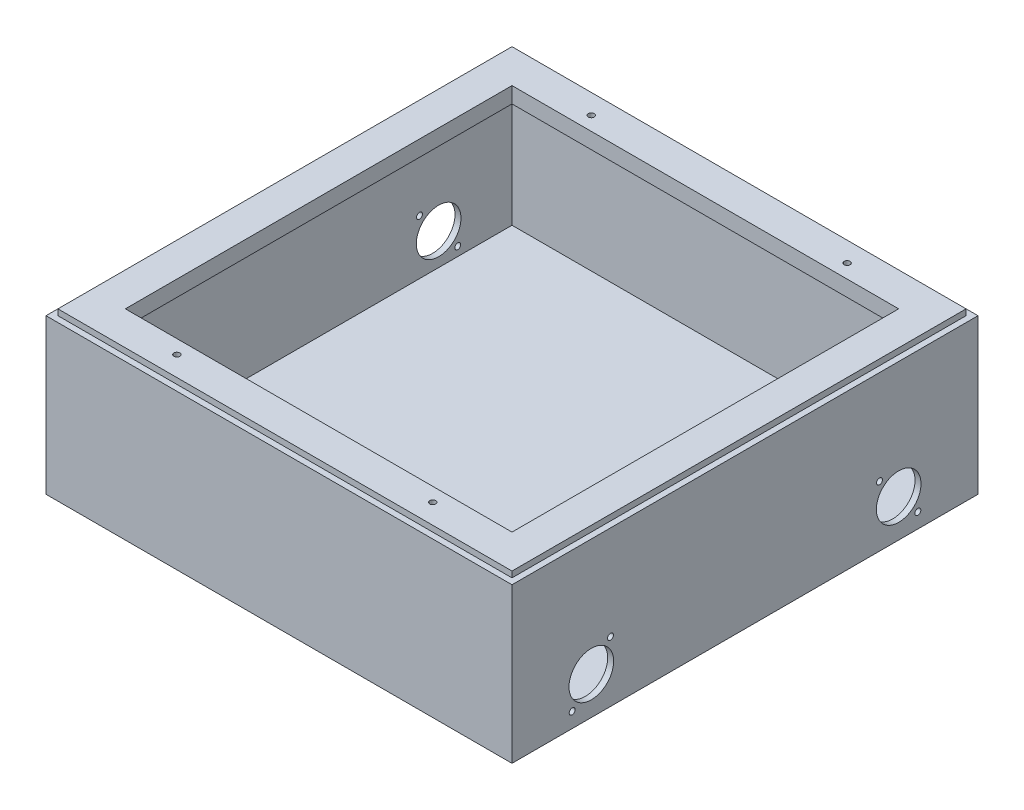
ISO-10303-21;
HEADER;
FILE_DESCRIPTION(('STEP AP214'),'2;1');
FILE_NAME('part.step','',(''),(''),'','','');
FILE_SCHEMA(('AUTOMOTIVE_DESIGN { 1 0 10303 214 1 1 1 1 }'));
ENDSEC;
DATA;
#1=APPLICATION_CONTEXT('core data for automotive mechanical design processes');
#2=APPLICATION_PROTOCOL_DEFINITION('international standard','automotive_design',2000,#1);
#3=PRODUCT_CONTEXT('',#1,'mechanical');
#4=PRODUCT('Part','Part','',(#3));
#5=PRODUCT_RELATED_PRODUCT_CATEGORY('part','',(#4));
#6=PRODUCT_DEFINITION_FORMATION('','',#4);
#7=PRODUCT_DEFINITION_CONTEXT('part definition',#1,'design');
#8=PRODUCT_DEFINITION('design','',#6,#7);
#9=PRODUCT_DEFINITION_SHAPE('','',#8);
#10=(LENGTH_UNIT() NAMED_UNIT(*) SI_UNIT(.MILLI.,.METRE.));
#11=(NAMED_UNIT(*) PLANE_ANGLE_UNIT() SI_UNIT($,.RADIAN.));
#12=(NAMED_UNIT(*) SI_UNIT($,.STERADIAN.) SOLID_ANGLE_UNIT());
#13=UNCERTAINTY_MEASURE_WITH_UNIT(LENGTH_MEASURE(1.E-05),#10,'distance_accuracy_value','');
#14=(GEOMETRIC_REPRESENTATION_CONTEXT(3) GLOBAL_UNCERTAINTY_ASSIGNED_CONTEXT((#13)) GLOBAL_UNIT_ASSIGNED_CONTEXT((#10,
#11,#12)) REPRESENTATION_CONTEXT('',''));
#15=CARTESIAN_POINT('',(0.,0.,0.));
#16=DIRECTION('',(0.,0.,1.));
#17=DIRECTION('',(1.,0.,0.));
#18=AXIS2_PLACEMENT_3D('',#15,#16,#17);
#19=CARTESIAN_POINT('',(0.,73.,0.));
#20=DIRECTION('',(0.,1.,0.));
#21=DIRECTION('',(0.,0.,1.));
#22=AXIS2_PLACEMENT_3D('',#19,#20,#21);
#23=PLANE('',#22);
#24=DIRECTION('',(0.,0.,-1.));
#25=VECTOR('',#24,1.);
#26=CARTESIAN_POINT('',(20.,73.,20.));
#27=LINE('',#26,#25);
#28=CARTESIAN_POINT('',(20.,73.,215.));
#29=VERTEX_POINT('',#28);
#30=CARTESIAN_POINT('',(20.,73.,20.));
#31=VERTEX_POINT('',#30);
#32=EDGE_CURVE('E264',#29,#31,#27,.T.);
#33=ORIENTED_EDGE('',*,*,#32,.F.);
#34=DIRECTION('',(-1.,0.,0.));
#35=VECTOR('',#34,1.);
#36=CARTESIAN_POINT('',(20.,73.,215.));
#37=LINE('',#36,#35);
#38=CARTESIAN_POINT('',(215.,73.,215.));
#39=VERTEX_POINT('',#38);
#40=EDGE_CURVE('E272',#39,#29,#37,.T.);
#41=ORIENTED_EDGE('',*,*,#40,.F.);
#42=DIRECTION('',(0.,0.,1.));
#43=VECTOR('',#42,1.);
#44=CARTESIAN_POINT('',(215.,73.,215.));
#45=LINE('',#44,#43);
#46=CARTESIAN_POINT('',(215.,73.,20.));
#47=VERTEX_POINT('',#46);
#48=EDGE_CURVE('E281',#47,#39,#45,.T.);
#49=ORIENTED_EDGE('',*,*,#48,.F.);
#50=DIRECTION('',(1.,0.,0.));
#51=VECTOR('',#50,1.);
#52=CARTESIAN_POINT('',(215.,73.,20.));
#53=LINE('',#52,#51);
#54=EDGE_CURVE('E284',#31,#47,#53,.T.);
#55=ORIENTED_EDGE('',*,*,#54,.F.);
#56=EDGE_LOOP('',(#33,#41,#49,#55));
#57=FACE_BOUND('',#56,.T.);
#58=DIRECTION('',(-1.,0.,0.));
#59=VECTOR('',#58,1.);
#60=CARTESIAN_POINT('',(0.,73.,3.));
#61=LINE('',#60,#59);
#62=CARTESIAN_POINT('',(232.,73.,3.));
#63=VERTEX_POINT('',#62);
#64=CARTESIAN_POINT('',(3.,73.,3.));
#65=VERTEX_POINT('',#64);
#66=EDGE_CURVE('E403',#63,#65,#61,.T.);
#67=ORIENTED_EDGE('',*,*,#66,.F.);
#68=DIRECTION('',(0.,0.,-1.));
#69=VECTOR('',#68,1.);
#70=CARTESIAN_POINT('',(232.,73.,0.));
#71=LINE('',#70,#69);
#72=CARTESIAN_POINT('',(232.,73.,232.));
#73=VERTEX_POINT('',#72);
#74=EDGE_CURVE('E286',#73,#63,#71,.T.);
#75=ORIENTED_EDGE('',*,*,#74,.F.);
#76=DIRECTION('',(-1.,0.,0.));
#77=VECTOR('',#76,1.);
#78=CARTESIAN_POINT('',(0.,73.,232.));
#79=LINE('',#78,#77);
#80=CARTESIAN_POINT('',(3.,73.,232.));
#81=VERTEX_POINT('',#80);
#82=EDGE_CURVE('E453',#73,#81,#79,.T.);
#83=ORIENTED_EDGE('',*,*,#82,.T.);
#84=DIRECTION('',(0.,0.,-1.));
#85=VECTOR('',#84,1.);
#86=CARTESIAN_POINT('',(3.,73.,0.));
#87=LINE('',#86,#85);
#88=EDGE_CURVE('E293',#81,#65,#87,.T.);
#89=ORIENTED_EDGE('',*,*,#88,.T.);
#90=EDGE_LOOP('',(#67,#75,#83,#89));
#91=FACE_BOUND('',#90,.T.);
#92=ADVANCED_FACE('F98',(#57,#91),#23,.F.);
#93=CARTESIAN_POINT('',(0.,81.,3.));
#94=DIRECTION('',(0.,0.,-1.));
#95=DIRECTION('',(-1.,0.,0.));
#96=AXIS2_PLACEMENT_3D('',#93,#94,#95);
#97=PLANE('',#96);
#98=DIRECTION('',(1.,0.,0.));
#99=VECTOR('',#98,1.);
#100=CARTESIAN_POINT('',(0.,78.,3.));
#101=LINE('',#100,#99);
#102=CARTESIAN_POINT('',(3.,78.,3.));
#103=VERTEX_POINT('',#102);
#104=CARTESIAN_POINT('',(232.,78.,3.));
#105=VERTEX_POINT('',#104);
#106=EDGE_CURVE('E216',#103,#105,#101,.T.);
#107=ORIENTED_EDGE('',*,*,#106,.F.);
#108=DIRECTION('',(0.,-1.,0.));
#109=VECTOR('',#108,1.);
#110=CARTESIAN_POINT('',(3.,81.,3.));
#111=LINE('',#110,#109);
#112=CARTESIAN_POINT('',(3.,81.,3.));
#113=VERTEX_POINT('',#112);
#114=EDGE_CURVE('E12',#113,#103,#111,.T.);
#115=ORIENTED_EDGE('',*,*,#114,.F.);
#116=DIRECTION('',(1.,0.,0.));
#117=VECTOR('',#116,1.);
#118=CARTESIAN_POINT('',(0.,81.,3.));
#119=LINE('',#118,#117);
#120=CARTESIAN_POINT('',(232.,81.,3.));
#121=VERTEX_POINT('',#120);
#122=EDGE_CURVE('E186',#113,#121,#119,.T.);
#123=ORIENTED_EDGE('',*,*,#122,.T.);
#124=DIRECTION('',(0.,-1.,0.));
#125=VECTOR('',#124,1.);
#126=CARTESIAN_POINT('',(232.,81.,3.));
#127=LINE('',#126,#125);
#128=EDGE_CURVE('E125',#121,#105,#127,.T.);
#129=ORIENTED_EDGE('',*,*,#128,.T.);
#130=EDGE_LOOP('',(#107,#115,#123,#129));
#131=FACE_BOUND('',#130,.T.);
#132=ADVANCED_FACE('F349',(#131),#97,.T.);
#133=CARTESIAN_POINT('',(3.,81.,0.));
#134=DIRECTION('',(-1.,0.,0.));
#135=DIRECTION('',(0.,0.,1.));
#136=AXIS2_PLACEMENT_3D('',#133,#134,#135);
#137=PLANE('',#136);
#138=DIRECTION('',(0.,0.,-1.));
#139=VECTOR('',#138,1.);
#140=CARTESIAN_POINT('',(3.,78.,0.));
#141=LINE('',#140,#139);
#142=CARTESIAN_POINT('',(3.,78.,232.));
#143=VERTEX_POINT('',#142);
#144=EDGE_CURVE('E171',#143,#103,#141,.T.);
#145=ORIENTED_EDGE('',*,*,#144,.F.);
#146=DIRECTION('',(0.,-1.,0.));
#147=VECTOR('',#146,1.);
#148=CARTESIAN_POINT('',(3.,81.,232.));
#149=LINE('',#148,#147);
#150=CARTESIAN_POINT('',(3.,81.,232.));
#151=VERTEX_POINT('',#150);
#152=EDGE_CURVE('E108',#151,#143,#149,.T.);
#153=ORIENTED_EDGE('',*,*,#152,.F.);
#154=DIRECTION('',(0.,0.,-1.));
#155=VECTOR('',#154,1.);
#156=CARTESIAN_POINT('',(3.,81.,0.));
#157=LINE('',#156,#155);
#158=EDGE_CURVE('E169',#151,#113,#157,.T.);
#159=ORIENTED_EDGE('',*,*,#158,.T.);
#160=ORIENTED_EDGE('',*,*,#114,.T.);
#161=EDGE_LOOP('',(#145,#153,#159,#160));
#162=FACE_BOUND('',#161,.T.);
#163=ADVANCED_FACE('F168',(#162),#137,.T.);
#164=CARTESIAN_POINT('',(0.,81.,232.));
#165=DIRECTION('',(0.,0.,1.));
#166=DIRECTION('',(1.,0.,0.));
#167=AXIS2_PLACEMENT_3D('',#164,#165,#166);
#168=PLANE('',#167);
#169=DIRECTION('',(-1.,0.,0.));
#170=VECTOR('',#169,1.);
#171=CARTESIAN_POINT('',(0.,78.,232.));
#172=LINE('',#171,#170);
#173=CARTESIAN_POINT('',(232.,78.,232.));
#174=VERTEX_POINT('',#173);
#175=EDGE_CURVE('E222',#174,#143,#172,.T.);
#176=ORIENTED_EDGE('',*,*,#175,.F.);
#177=DIRECTION('',(0.,-1.,0.));
#178=VECTOR('',#177,1.);
#179=CARTESIAN_POINT('',(232.,81.,232.));
#180=LINE('',#179,#178);
#181=CARTESIAN_POINT('',(232.,81.,232.));
#182=VERTEX_POINT('',#181);
#183=EDGE_CURVE('E177',#182,#174,#180,.T.);
#184=ORIENTED_EDGE('',*,*,#183,.F.);
#185=DIRECTION('',(-1.,0.,0.));
#186=VECTOR('',#185,1.);
#187=CARTESIAN_POINT('',(0.,81.,232.));
#188=LINE('',#187,#186);
#189=EDGE_CURVE('E185',#182,#151,#188,.T.);
#190=ORIENTED_EDGE('',*,*,#189,.T.);
#191=ORIENTED_EDGE('',*,*,#152,.T.);
#192=EDGE_LOOP('',(#176,#184,#190,#191));
#193=FACE_BOUND('',#192,.T.);
#194=ADVANCED_FACE('F189',(#193),#168,.T.);
#195=CARTESIAN_POINT('',(0.,81.,215.));
#196=DIRECTION('',(0.,0.,-1.));
#197=DIRECTION('',(-1.,0.,0.));
#198=AXIS2_PLACEMENT_3D('',#195,#196,#197);
#199=PLANE('',#198);
#200=DIRECTION('',(0.,-1.,0.));
#201=VECTOR('',#200,1.);
#202=CARTESIAN_POINT('',(215.,81.,215.));
#203=LINE('',#202,#201);
#204=CARTESIAN_POINT('',(215.,81.,215.));
#205=VERTEX_POINT('',#204);
#206=EDGE_CURVE('E206',#205,#39,#203,.T.);
#207=ORIENTED_EDGE('',*,*,#206,.T.);
#208=ORIENTED_EDGE('',*,*,#40,.T.);
#209=DIRECTION('',(0.,-1.,0.));
#210=VECTOR('',#209,1.);
#211=CARTESIAN_POINT('',(20.,81.,215.));
#212=LINE('',#211,#210);
#213=CARTESIAN_POINT('',(20.,81.,215.));
#214=VERTEX_POINT('',#213);
#215=EDGE_CURVE('E102',#214,#29,#212,.T.);
#216=ORIENTED_EDGE('',*,*,#215,.F.);
#217=DIRECTION('',(1.,0.,0.));
#218=VECTOR('',#217,1.);
#219=CARTESIAN_POINT('',(0.,81.,215.));
#220=LINE('',#219,#218);
#221=EDGE_CURVE('E336',#214,#205,#220,.T.);
#222=ORIENTED_EDGE('',*,*,#221,.T.);
#223=EDGE_LOOP('',(#207,#208,#216,#222));
#224=FACE_BOUND('',#223,.T.);
#225=ADVANCED_FACE('F273',(#224),#199,.T.);
#226=CARTESIAN_POINT('',(20.,81.,0.));
#227=DIRECTION('',(1.,0.,0.));
#228=DIRECTION('',(0.,0.,-1.));
#229=AXIS2_PLACEMENT_3D('',#226,#227,#228);
#230=PLANE('',#229);
#231=ORIENTED_EDGE('',*,*,#215,.T.);
#232=ORIENTED_EDGE('',*,*,#32,.T.);
#233=DIRECTION('',(0.,-1.,0.));
#234=VECTOR('',#233,1.);
#235=CARTESIAN_POINT('',(20.,81.,20.));
#236=LINE('',#235,#234);
#237=CARTESIAN_POINT('',(20.,81.,20.));
#238=VERTEX_POINT('',#237);
#239=EDGE_CURVE('E248',#238,#31,#236,.T.);
#240=ORIENTED_EDGE('',*,*,#239,.F.);
#241=DIRECTION('',(0.,0.,1.));
#242=VECTOR('',#241,1.);
#243=CARTESIAN_POINT('',(20.,81.,0.));
#244=LINE('',#243,#242);
#245=EDGE_CURVE('E267',#238,#214,#244,.T.);
#246=ORIENTED_EDGE('',*,*,#245,.T.);
#247=EDGE_LOOP('',(#231,#232,#240,#246));
#248=FACE_BOUND('',#247,.T.);
#249=ADVANCED_FACE('F262',(#248),#230,.T.);
#250=CARTESIAN_POINT('',(0.,81.,20.));
#251=DIRECTION('',(0.,0.,-1.));
#252=DIRECTION('',(-1.,0.,0.));
#253=AXIS2_PLACEMENT_3D('',#250,#251,#252);
#254=PLANE('',#253);
#255=ORIENTED_EDGE('',*,*,#239,.T.);
#256=ORIENTED_EDGE('',*,*,#54,.T.);
#257=DIRECTION('',(0.,-1.,0.));
#258=VECTOR('',#257,1.);
#259=CARTESIAN_POINT('',(215.,81.,20.));
#260=LINE('',#259,#258);
#261=CARTESIAN_POINT('',(215.,81.,20.));
#262=VERTEX_POINT('',#261);
#263=EDGE_CURVE('E245',#262,#47,#260,.T.);
#264=ORIENTED_EDGE('',*,*,#263,.F.);
#265=DIRECTION('',(1.,0.,0.));
#266=VECTOR('',#265,1.);
#267=CARTESIAN_POINT('',(0.,81.,20.));
#268=LINE('',#267,#266);
#269=EDGE_CURVE('E341',#238,#262,#268,.T.);
#270=ORIENTED_EDGE('',*,*,#269,.F.);
#271=EDGE_LOOP('',(#255,#256,#264,#270));
#272=FACE_BOUND('',#271,.T.);
#273=ADVANCED_FACE('F651',(#272),#254,.F.);
#274=CARTESIAN_POINT('',(182.,81.,222.));
#275=DIRECTION('',(0.,-1.,0.));
#276=DIRECTION('',(0.,0.,-1.));
#277=AXIS2_PLACEMENT_3D('',#274,#275,#276);
#278=CYLINDRICAL_SURFACE('',#277,1.50000000000002);
#279=CARTESIAN_POINT('',(182.,81.,222.));
#280=DIRECTION('',(0.,1.,0.));
#281=DIRECTION('',(0.,0.,1.));
#282=AXIS2_PLACEMENT_3D('',#279,#280,#281);
#283=CIRCLE('',#282,1.50000000000002);
#284=CARTESIAN_POINT('',(182.,81.,223.5));
#285=VERTEX_POINT('',#284);
#286=EDGE_CURVE('E195',#285,#285,#283,.T.);
#287=ORIENTED_EDGE('',*,*,#286,.T.);
#288=EDGE_LOOP('',(#287));
#289=FACE_BOUND('',#288,.T.);
#290=CARTESIAN_POINT('',(182.,78.,222.));
#291=DIRECTION('',(0.,1.,0.));
#292=DIRECTION('',(0.,0.,1.));
#293=AXIS2_PLACEMENT_3D('',#290,#291,#292);
#294=CIRCLE('',#293,1.50000000000002);
#295=CARTESIAN_POINT('',(182.,78.,223.5));
#296=VERTEX_POINT('',#295);
#297=EDGE_CURVE('E229',#296,#296,#294,.T.);
#298=ORIENTED_EDGE('',*,*,#297,.F.);
#299=EDGE_LOOP('',(#298));
#300=FACE_BOUND('',#299,.T.);
#301=ADVANCED_FACE('F653',(#289,#300),#278,.F.);
#302=CARTESIAN_POINT('',(232.,81.,0.));
#303=DIRECTION('',(1.,0.,0.));
#304=DIRECTION('',(0.,0.,-1.));
#305=AXIS2_PLACEMENT_3D('',#302,#303,#304);
#306=PLANE('',#305);
#307=DIRECTION('',(0.,0.,1.));
#308=VECTOR('',#307,1.);
#309=CARTESIAN_POINT('',(232.,78.,0.));
#310=LINE('',#309,#308);
#311=EDGE_CURVE('E225',#105,#174,#310,.T.);
#312=ORIENTED_EDGE('',*,*,#311,.F.);
#313=ORIENTED_EDGE('',*,*,#128,.F.);
#314=DIRECTION('',(0.,0.,1.));
#315=VECTOR('',#314,1.);
#316=CARTESIAN_POINT('',(232.,81.,0.));
#317=LINE('',#316,#315);
#318=EDGE_CURVE('E191',#121,#182,#317,.T.);
#319=ORIENTED_EDGE('',*,*,#318,.T.);
#320=ORIENTED_EDGE('',*,*,#183,.T.);
#321=EDGE_LOOP('',(#312,#313,#319,#320));
#322=FACE_BOUND('',#321,.T.);
#323=ADVANCED_FACE('F350',(#322),#306,.T.);
#324=CARTESIAN_POINT('',(215.,81.,0.));
#325=DIRECTION('',(1.,0.,0.));
#326=DIRECTION('',(0.,0.,-1.));
#327=AXIS2_PLACEMENT_3D('',#324,#325,#326);
#328=PLANE('',#327);
#329=ORIENTED_EDGE('',*,*,#263,.T.);
#330=ORIENTED_EDGE('',*,*,#48,.T.);
#331=ORIENTED_EDGE('',*,*,#206,.F.);
#332=DIRECTION('',(0.,0.,1.));
#333=VECTOR('',#332,1.);
#334=CARTESIAN_POINT('',(215.,81.,0.));
#335=LINE('',#334,#333);
#336=EDGE_CURVE('E345',#262,#205,#335,.T.);
#337=ORIENTED_EDGE('',*,*,#336,.F.);
#338=EDGE_LOOP('',(#329,#330,#331,#337));
#339=FACE_BOUND('',#338,.T.);
#340=ADVANCED_FACE('F640',(#339),#328,.F.);
#341=CARTESIAN_POINT('',(53.,81.,13.));
#342=DIRECTION('',(0.,-1.,0.));
#343=DIRECTION('',(0.,0.,-1.));
#344=AXIS2_PLACEMENT_3D('',#341,#342,#343);
#345=CYLINDRICAL_SURFACE('',#344,1.5);
#346=CARTESIAN_POINT('',(53.,81.,13.));
#347=DIRECTION('',(0.,1.,0.));
#348=DIRECTION('',(0.,0.,1.));
#349=AXIS2_PLACEMENT_3D('',#346,#347,#348);
#350=CIRCLE('',#349,1.5);
#351=CARTESIAN_POINT('',(53.,81.,14.5));
#352=VERTEX_POINT('',#351);
#353=EDGE_CURVE('E332',#352,#352,#350,.T.);
#354=ORIENTED_EDGE('',*,*,#353,.T.);
#355=EDGE_LOOP('',(#354));
#356=FACE_BOUND('',#355,.T.);
#357=CARTESIAN_POINT('',(53.,78.,13.));
#358=DIRECTION('',(0.,1.,0.));
#359=DIRECTION('',(0.,0.,1.));
#360=AXIS2_PLACEMENT_3D('',#357,#358,#359);
#361=CIRCLE('',#360,1.5);
#362=CARTESIAN_POINT('',(53.,78.,14.5));
#363=VERTEX_POINT('',#362);
#364=EDGE_CURVE('E211',#363,#363,#361,.T.);
#365=ORIENTED_EDGE('',*,*,#364,.F.);
#366=EDGE_LOOP('',(#365));
#367=FACE_BOUND('',#366,.T.);
#368=ADVANCED_FACE('F632',(#356,#367),#345,.F.);
#369=CARTESIAN_POINT('',(182.,81.,13.));
#370=DIRECTION('',(0.,-1.,0.));
#371=DIRECTION('',(0.,0.,-1.));
#372=AXIS2_PLACEMENT_3D('',#369,#370,#371);
#373=CYLINDRICAL_SURFACE('',#372,1.50000000000003);
#374=CARTESIAN_POINT('',(182.,81.,13.));
#375=DIRECTION('',(0.,1.,0.));
#376=DIRECTION('',(0.,0.,1.));
#377=AXIS2_PLACEMENT_3D('',#374,#375,#376);
#378=CIRCLE('',#377,1.50000000000003);
#379=CARTESIAN_POINT('',(182.,81.,14.5));
#380=VERTEX_POINT('',#379);
#381=EDGE_CURVE('E233',#380,#380,#378,.F.);
#382=ORIENTED_EDGE('',*,*,#381,.F.);
#383=EDGE_LOOP('',(#382));
#384=FACE_BOUND('',#383,.T.);
#385=CARTESIAN_POINT('',(182.,78.,13.));
#386=DIRECTION('',(0.,1.,0.));
#387=DIRECTION('',(0.,0.,1.));
#388=AXIS2_PLACEMENT_3D('',#385,#386,#387);
#389=CIRCLE('',#388,1.50000000000003);
#390=CARTESIAN_POINT('',(182.,78.,14.5));
#391=VERTEX_POINT('',#390);
#392=EDGE_CURVE('E207',#391,#391,#389,.F.);
#393=ORIENTED_EDGE('',*,*,#392,.T.);
#394=EDGE_LOOP('',(#393));
#395=FACE_BOUND('',#394,.T.);
#396=ADVANCED_FACE('F100',(#384,#395),#373,.F.);
#397=CARTESIAN_POINT('',(53.,81.,222.));
#398=DIRECTION('',(0.,-1.,0.));
#399=DIRECTION('',(0.,0.,-1.));
#400=AXIS2_PLACEMENT_3D('',#397,#398,#399);
#401=CYLINDRICAL_SURFACE('',#400,1.5);
#402=CARTESIAN_POINT('',(53.,81.,222.));
#403=DIRECTION('',(0.,1.,0.));
#404=DIRECTION('',(0.,0.,1.));
#405=AXIS2_PLACEMENT_3D('',#402,#403,#404);
#406=CIRCLE('',#405,1.5);
#407=CARTESIAN_POINT('',(53.,81.,223.5));
#408=VERTEX_POINT('',#407);
#409=EDGE_CURVE('E202',#408,#408,#406,.F.);
#410=ORIENTED_EDGE('',*,*,#409,.F.);
#411=EDGE_LOOP('',(#410));
#412=FACE_BOUND('',#411,.T.);
#413=CARTESIAN_POINT('',(53.,78.,222.));
#414=DIRECTION('',(0.,1.,0.));
#415=DIRECTION('',(0.,0.,1.));
#416=AXIS2_PLACEMENT_3D('',#413,#414,#415);
#417=CIRCLE('',#416,1.5);
#418=CARTESIAN_POINT('',(53.,78.,223.5));
#419=VERTEX_POINT('',#418);
#420=EDGE_CURVE('E212',#419,#419,#417,.F.);
#421=ORIENTED_EDGE('',*,*,#420,.T.);
#422=EDGE_LOOP('',(#421));
#423=FACE_BOUND('',#422,.T.);
#424=ADVANCED_FACE('F631',(#412,#423),#401,.F.);
#425=CARTESIAN_POINT('',(0.,81.,0.));
#426=DIRECTION('',(0.,1.,0.));
#427=DIRECTION('',(0.,0.,1.));
#428=AXIS2_PLACEMENT_3D('',#425,#426,#427);
#429=PLANE('',#428);
#430=ORIENTED_EDGE('',*,*,#381,.T.);
#431=EDGE_LOOP('',(#430));
#432=FACE_BOUND('',#431,.T.);
#433=ORIENTED_EDGE('',*,*,#353,.F.);
#434=EDGE_LOOP('',(#433));
#435=FACE_BOUND('',#434,.T.);
#436=ORIENTED_EDGE('',*,*,#221,.F.);
#437=ORIENTED_EDGE('',*,*,#245,.F.);
#438=ORIENTED_EDGE('',*,*,#269,.T.);
#439=ORIENTED_EDGE('',*,*,#336,.T.);
#440=EDGE_LOOP('',(#436,#437,#438,#439));
#441=FACE_BOUND('',#440,.T.);
#442=ORIENTED_EDGE('',*,*,#122,.F.);
#443=ORIENTED_EDGE('',*,*,#158,.F.);
#444=ORIENTED_EDGE('',*,*,#189,.F.);
#445=ORIENTED_EDGE('',*,*,#318,.F.);
#446=EDGE_LOOP('',(#442,#443,#444,#445));
#447=FACE_BOUND('',#446,.T.);
#448=ORIENTED_EDGE('',*,*,#286,.F.);
#449=EDGE_LOOP('',(#448));
#450=FACE_BOUND('',#449,.T.);
#451=ORIENTED_EDGE('',*,*,#409,.T.);
#452=EDGE_LOOP('',(#451));
#453=FACE_BOUND('',#452,.T.);
#454=ADVANCED_FACE('F182',(#432,#435,#441,#447,#450,#453),#429,.T.);
#455=CARTESIAN_POINT('',(0.,78.,0.));
#456=DIRECTION('',(0.,1.,0.));
#457=DIRECTION('',(0.,0.,1.));
#458=AXIS2_PLACEMENT_3D('',#455,#456,#457);
#459=PLANE('',#458);
#460=ORIENTED_EDGE('',*,*,#420,.F.);
#461=EDGE_LOOP('',(#460));
#462=FACE_BOUND('',#461,.T.);
#463=ADVANCED_FACE('F615',(#462),#459,.T.);
#464=ORIENTED_EDGE('',*,*,#297,.T.);
#465=EDGE_LOOP('',(#464));
#466=FACE_BOUND('',#465,.T.);
#467=ADVANCED_FACE('F600',(#466),#459,.T.);
#468=CARTESIAN_POINT('',(0.,73.,235.));
#469=DIRECTION('',(0.,0.,-1.));
#470=DIRECTION('',(-1.,0.,0.));
#471=AXIS2_PLACEMENT_3D('',#468,#469,#470);
#472=PLANE('',#471);
#473=DIRECTION('',(-1.,0.,0.));
#474=VECTOR('',#473,1.);
#475=CARTESIAN_POINT('',(0.,78.,235.));
#476=LINE('',#475,#474);
#477=CARTESIAN_POINT('',(235.,78.,235.));
#478=VERTEX_POINT('',#477);
#479=CARTESIAN_POINT('',(0.,78.,235.));
#480=VERTEX_POINT('',#479);
#481=EDGE_CURVE('E310',#478,#480,#476,.T.);
#482=ORIENTED_EDGE('',*,*,#481,.T.);
#483=DIRECTION('',(0.,1.,0.));
#484=VECTOR('',#483,1.);
#485=CARTESIAN_POINT('',(0.,73.,235.));
#486=LINE('',#485,#484);
#487=CARTESIAN_POINT('',(0.,0.,235.));
#488=VERTEX_POINT('',#487);
#489=EDGE_CURVE('E314',#488,#480,#486,.T.);
#490=ORIENTED_EDGE('',*,*,#489,.F.);
#491=DIRECTION('',(1.,0.,0.));
#492=VECTOR('',#491,1.);
#493=CARTESIAN_POINT('',(0.,0.,235.));
#494=LINE('',#493,#492);
#495=CARTESIAN_POINT('',(235.,0.,235.));
#496=VERTEX_POINT('',#495);
#497=EDGE_CURVE('E441',#488,#496,#494,.T.);
#498=ORIENTED_EDGE('',*,*,#497,.T.);
#499=DIRECTION('',(0.,1.,0.));
#500=VECTOR('',#499,1.);
#501=CARTESIAN_POINT('',(235.,73.,235.));
#502=LINE('',#501,#500);
#503=EDGE_CURVE('E318',#496,#478,#502,.T.);
#504=ORIENTED_EDGE('',*,*,#503,.T.);
#505=EDGE_LOOP('',(#482,#490,#498,#504));
#506=FACE_BOUND('',#505,.T.);
#507=ADVANCED_FACE('F590',(#506),#472,.F.);
#508=CARTESIAN_POINT('',(235.,73.,235.));
#509=DIRECTION('',(-1.,0.,0.));
#510=DIRECTION('',(0.,0.,1.));
#511=AXIS2_PLACEMENT_3D('',#508,#509,#510);
#512=PLANE('',#511);
#513=DIRECTION('',(0.,0.,1.));
#514=VECTOR('',#513,1.);
#515=CARTESIAN_POINT('',(235.,78.,235.));
#516=LINE('',#515,#514);
#517=CARTESIAN_POINT('',(235.,78.,0.));
#518=VERTEX_POINT('',#517);
#519=EDGE_CURVE('E306',#518,#478,#516,.T.);
#520=ORIENTED_EDGE('',*,*,#519,.T.);
#521=ORIENTED_EDGE('',*,*,#503,.F.);
#522=DIRECTION('',(0.,0.,-1.));
#523=VECTOR('',#522,1.);
#524=CARTESIAN_POINT('',(235.,0.,0.));
#525=LINE('',#524,#523);
#526=CARTESIAN_POINT('',(235.,0.,0.));
#527=VERTEX_POINT('',#526);
#528=EDGE_CURVE('E445',#496,#527,#525,.T.);
#529=ORIENTED_EDGE('',*,*,#528,.T.);
#530=DIRECTION('',(0.,1.,0.));
#531=VECTOR('',#530,1.);
#532=CARTESIAN_POINT('',(235.,73.,0.));
#533=LINE('',#532,#531);
#534=EDGE_CURVE('E322',#527,#518,#533,.T.);
#535=ORIENTED_EDGE('',*,*,#534,.T.);
#536=EDGE_LOOP('',(#520,#521,#529,#535));
#537=FACE_BOUND('',#536,.T.);
#538=CARTESIAN_POINT('',(235.,7.52347448688333,204.658641837587));
#539=DIRECTION('',(-1.,0.,0.));
#540=DIRECTION('',(0.,0.,1.));
#541=AXIS2_PLACEMENT_3D('',#538,#539,#540);
#542=CIRCLE('',#541,1.49999999999997);
#543=CARTESIAN_POINT('',(235.,7.52347448688333,206.158641837587));
#544=VERTEX_POINT('',#543);
#545=EDGE_CURVE('E516',#544,#544,#542,.T.);
#546=ORIENTED_EDGE('',*,*,#545,.T.);
#547=EDGE_LOOP('',(#546));
#548=FACE_BOUND('',#547,.T.);
#549=CARTESIAN_POINT('',(235.,30.4765255131166,185.341358162413));
#550=DIRECTION('',(-1.,0.,0.));
#551=DIRECTION('',(0.,0.,1.));
#552=AXIS2_PLACEMENT_3D('',#549,#550,#551);
#553=CIRCLE('',#552,1.49999999999987);
#554=CARTESIAN_POINT('',(235.,30.4765255131166,186.841358162413));
#555=VERTEX_POINT('',#554);
#556=EDGE_CURVE('E526',#555,#555,#553,.F.);
#557=ORIENTED_EDGE('',*,*,#556,.F.);
#558=EDGE_LOOP('',(#557));
#559=FACE_BOUND('',#558,.T.);
#560=CARTESIAN_POINT('',(235.,19.,195.));
#561=DIRECTION('',(-1.,0.,0.));
#562=DIRECTION('',(0.,0.,1.));
#563=AXIS2_PLACEMENT_3D('',#560,#561,#562);
#564=CIRCLE('',#563,11.255);
#565=CARTESIAN_POINT('',(235.,19.,206.255));
#566=VERTEX_POINT('',#565);
#567=EDGE_CURVE('E556',#566,#566,#564,.F.);
#568=ORIENTED_EDGE('',*,*,#567,.F.);
#569=EDGE_LOOP('',(#568));
#570=FACE_BOUND('',#569,.T.);
#571=CARTESIAN_POINT('',(235.,7.52347448688336,30.3413581624133));
#572=DIRECTION('',(-1.,0.,0.));
#573=DIRECTION('',(0.,0.,1.));
#574=AXIS2_PLACEMENT_3D('',#571,#572,#573);
#575=CIRCLE('',#574,1.49999999999998);
#576=CARTESIAN_POINT('',(235.,7.52347448688336,31.8413581624133));
#577=VERTEX_POINT('',#576);
#578=EDGE_CURVE('E546',#577,#577,#575,.F.);
#579=ORIENTED_EDGE('',*,*,#578,.F.);
#580=EDGE_LOOP('',(#579));
#581=FACE_BOUND('',#580,.T.);
#582=CARTESIAN_POINT('',(235.,19.,40.0000000000001));
#583=DIRECTION('',(-1.,0.,0.));
#584=DIRECTION('',(0.,0.,1.));
#585=AXIS2_PLACEMENT_3D('',#582,#583,#584);
#586=CIRCLE('',#585,11.255);
#587=CARTESIAN_POINT('',(235.,19.,51.2550000000001));
#588=VERTEX_POINT('',#587);
#589=EDGE_CURVE('E536',#588,#588,#586,.T.);
#590=ORIENTED_EDGE('',*,*,#589,.T.);
#591=EDGE_LOOP('',(#590));
#592=FACE_BOUND('',#591,.T.);
#593=CARTESIAN_POINT('',(235.,30.4765255131167,49.6586418375869));
#594=DIRECTION('',(-1.,0.,0.));
#595=DIRECTION('',(0.,0.,1.));
#596=AXIS2_PLACEMENT_3D('',#593,#594,#595);
#597=CIRCLE('',#596,1.5);
#598=CARTESIAN_POINT('',(235.,30.4765255131167,51.1586418375869));
#599=VERTEX_POINT('',#598);
#600=EDGE_CURVE('E506',#599,#599,#597,.T.);
#601=ORIENTED_EDGE('',*,*,#600,.T.);
#602=EDGE_LOOP('',(#601));
#603=FACE_BOUND('',#602,.T.);
#604=ADVANCED_FACE('F587',(#537,#548,#559,#570,#581,#592,#603),#512,.F.);
#605=CARTESIAN_POINT('',(235.,73.,0.));
#606=DIRECTION('',(0.,0.,1.));
#607=DIRECTION('',(1.,0.,0.));
#608=AXIS2_PLACEMENT_3D('',#605,#606,#607);
#609=PLANE('',#608);
#610=DIRECTION('',(1.,0.,0.));
#611=VECTOR('',#610,1.);
#612=CARTESIAN_POINT('',(235.,78.,0.));
#613=LINE('',#612,#611);
#614=CARTESIAN_POINT('',(0.,78.,0.));
#615=VERTEX_POINT('',#614);
#616=EDGE_CURVE('E302',#615,#518,#613,.T.);
#617=ORIENTED_EDGE('',*,*,#616,.T.);
#618=ORIENTED_EDGE('',*,*,#534,.F.);
#619=DIRECTION('',(-1.,0.,0.));
#620=VECTOR('',#619,1.);
#621=CARTESIAN_POINT('',(0.,0.,0.));
#622=LINE('',#621,#620);
#623=CARTESIAN_POINT('',(0.,0.,0.));
#624=VERTEX_POINT('',#623);
#625=EDGE_CURVE('E449',#527,#624,#622,.T.);
#626=ORIENTED_EDGE('',*,*,#625,.T.);
#627=DIRECTION('',(0.,1.,0.));
#628=VECTOR('',#627,1.);
#629=CARTESIAN_POINT('',(0.,73.,0.));
#630=LINE('',#629,#628);
#631=EDGE_CURVE('E237',#624,#615,#630,.T.);
#632=ORIENTED_EDGE('',*,*,#631,.T.);
#633=EDGE_LOOP('',(#617,#618,#626,#632));
#634=FACE_BOUND('',#633,.T.);
#635=ADVANCED_FACE('F589',(#634),#609,.F.);
#636=CARTESIAN_POINT('',(0.,73.,0.));
#637=DIRECTION('',(1.,0.,0.));
#638=DIRECTION('',(0.,0.,-1.));
#639=AXIS2_PLACEMENT_3D('',#636,#637,#638);
#640=PLANE('',#639);
#641=DIRECTION('',(0.,0.,-1.));
#642=VECTOR('',#641,1.);
#643=CARTESIAN_POINT('',(0.,78.,0.));
#644=LINE('',#643,#642);
#645=EDGE_CURVE('E280',#480,#615,#644,.T.);
#646=ORIENTED_EDGE('',*,*,#645,.T.);
#647=ORIENTED_EDGE('',*,*,#631,.F.);
#648=DIRECTION('',(0.,0.,1.));
#649=VECTOR('',#648,1.);
#650=CARTESIAN_POINT('',(0.,0.,0.));
#651=LINE('',#650,#649);
#652=EDGE_CURVE('E437',#624,#488,#651,.T.);
#653=ORIENTED_EDGE('',*,*,#652,.T.);
#654=ORIENTED_EDGE('',*,*,#489,.T.);
#655=EDGE_LOOP('',(#646,#647,#653,#654));
#656=FACE_BOUND('',#655,.T.);
#657=CARTESIAN_POINT('',(0.,7.52347448688333,204.658641837587));
#658=DIRECTION('',(1.,0.,0.));
#659=DIRECTION('',(0.,0.,-1.));
#660=AXIS2_PLACEMENT_3D('',#657,#658,#659);
#661=CIRCLE('',#660,1.49999999999997);
#662=CARTESIAN_POINT('',(0.,7.52347448688333,203.158641837587));
#663=VERTEX_POINT('',#662);
#664=EDGE_CURVE('E488',#663,#663,#661,.T.);
#665=ORIENTED_EDGE('',*,*,#664,.T.);
#666=EDGE_LOOP('',(#665));
#667=FACE_BOUND('',#666,.T.);
#668=CARTESIAN_POINT('',(0.,30.4765255131166,185.341358162413));
#669=DIRECTION('',(1.,0.,0.));
#670=DIRECTION('',(0.,0.,-1.));
#671=AXIS2_PLACEMENT_3D('',#668,#669,#670);
#672=CIRCLE('',#671,1.49999999999987);
#673=CARTESIAN_POINT('',(0.,30.4765255131166,183.841358162413));
#674=VERTEX_POINT('',#673);
#675=EDGE_CURVE('E482',#674,#674,#672,.F.);
#676=ORIENTED_EDGE('',*,*,#675,.F.);
#677=EDGE_LOOP('',(#676));
#678=FACE_BOUND('',#677,.T.);
#679=CARTESIAN_POINT('',(0.,19.,195.));
#680=DIRECTION('',(1.,0.,0.));
#681=DIRECTION('',(0.,0.,-1.));
#682=AXIS2_PLACEMENT_3D('',#679,#680,#681);
#683=CIRCLE('',#682,11.255);
#684=CARTESIAN_POINT('',(0.,19.,183.745));
#685=VERTEX_POINT('',#684);
#686=EDGE_CURVE('E464',#685,#685,#683,.F.);
#687=ORIENTED_EDGE('',*,*,#686,.F.);
#688=EDGE_LOOP('',(#687));
#689=FACE_BOUND('',#688,.T.);
#690=CARTESIAN_POINT('',(0.,7.52347448688336,30.3413581624133));
#691=DIRECTION('',(1.,0.,0.));
#692=DIRECTION('',(0.,0.,-1.));
#693=AXIS2_PLACEMENT_3D('',#690,#691,#692);
#694=CIRCLE('',#693,1.49999999999998);
#695=CARTESIAN_POINT('',(0.,7.52347448688336,28.8413581624133));
#696=VERTEX_POINT('',#695);
#697=EDGE_CURVE('E470',#696,#696,#694,.F.);
#698=ORIENTED_EDGE('',*,*,#697,.F.);
#699=EDGE_LOOP('',(#698));
#700=FACE_BOUND('',#699,.T.);
#701=CARTESIAN_POINT('',(0.,19.,40.0000000000001));
#702=DIRECTION('',(1.,0.,0.));
#703=DIRECTION('',(0.,0.,-1.));
#704=AXIS2_PLACEMENT_3D('',#701,#702,#703);
#705=CIRCLE('',#704,11.255);
#706=CARTESIAN_POINT('',(0.,19.,28.7450000000001));
#707=VERTEX_POINT('',#706);
#708=EDGE_CURVE('E476',#707,#707,#705,.T.);
#709=ORIENTED_EDGE('',*,*,#708,.T.);
#710=EDGE_LOOP('',(#709));
#711=FACE_BOUND('',#710,.T.);
#712=CARTESIAN_POINT('',(0.,30.4765255131167,49.6586418375869));
#713=DIRECTION('',(1.,0.,0.));
#714=DIRECTION('',(0.,0.,-1.));
#715=AXIS2_PLACEMENT_3D('',#712,#713,#714);
#716=CIRCLE('',#715,1.5);
#717=CARTESIAN_POINT('',(0.,30.4765255131167,48.158641837587));
#718=VERTEX_POINT('',#717);
#719=EDGE_CURVE('E418',#718,#718,#716,.T.);
#720=ORIENTED_EDGE('',*,*,#719,.T.);
#721=EDGE_LOOP('',(#720));
#722=FACE_BOUND('',#721,.T.);
#723=ADVANCED_FACE('F597',(#656,#667,#678,#689,#700,#711,#722),#640,.F.);
#724=ORIENTED_EDGE('',*,*,#144,.T.);
#725=ORIENTED_EDGE('',*,*,#106,.T.);
#726=ORIENTED_EDGE('',*,*,#311,.T.);
#727=ORIENTED_EDGE('',*,*,#175,.T.);
#728=EDGE_LOOP('',(#724,#725,#726,#727));
#729=FACE_BOUND('',#728,.T.);
#730=ORIENTED_EDGE('',*,*,#645,.F.);
#731=ORIENTED_EDGE('',*,*,#481,.F.);
#732=ORIENTED_EDGE('',*,*,#519,.F.);
#733=ORIENTED_EDGE('',*,*,#616,.F.);
#734=EDGE_LOOP('',(#730,#731,#732,#733));
#735=FACE_BOUND('',#734,.T.);
#736=ADVANCED_FACE('F352',(#729,#735),#459,.T.);
#737=ORIENTED_EDGE('',*,*,#364,.T.);
#738=EDGE_LOOP('',(#737));
#739=FACE_BOUND('',#738,.T.);
#740=ADVANCED_FACE('F622',(#739),#459,.T.);
#741=ORIENTED_EDGE('',*,*,#392,.F.);
#742=EDGE_LOOP('',(#741));
#743=FACE_BOUND('',#742,.T.);
#744=ADVANCED_FACE('F570',(#743),#459,.T.);
#745=CARTESIAN_POINT('',(232.,78.,0.));
#746=DIRECTION('',(1.,0.,0.));
#747=DIRECTION('',(0.,0.,-1.));
#748=AXIS2_PLACEMENT_3D('',#745,#746,#747);
#749=PLANE('',#748);
#750=CARTESIAN_POINT('',(232.,7.52347448688333,204.658641837587));
#751=DIRECTION('',(1.,0.,0.));
#752=DIRECTION('',(0.,0.,-1.));
#753=AXIS2_PLACEMENT_3D('',#750,#751,#752);
#754=CIRCLE('',#753,1.49999999999997);
#755=CARTESIAN_POINT('',(232.,7.52347448688333,203.158641837587));
#756=VERTEX_POINT('',#755);
#757=EDGE_CURVE('E481',#756,#756,#754,.T.);
#758=ORIENTED_EDGE('',*,*,#757,.T.);
#759=EDGE_LOOP('',(#758));
#760=FACE_BOUND('',#759,.T.);
#761=CARTESIAN_POINT('',(232.,30.4765255131166,185.341358162413));
#762=DIRECTION('',(1.,0.,0.));
#763=DIRECTION('',(0.,0.,-1.));
#764=AXIS2_PLACEMENT_3D('',#761,#762,#763);
#765=CIRCLE('',#764,1.49999999999987);
#766=CARTESIAN_POINT('',(232.,30.4765255131166,183.841358162413));
#767=VERTEX_POINT('',#766);
#768=EDGE_CURVE('E475',#767,#767,#765,.F.);
#769=ORIENTED_EDGE('',*,*,#768,.F.);
#770=EDGE_LOOP('',(#769));
#771=FACE_BOUND('',#770,.T.);
#772=CARTESIAN_POINT('',(232.,19.,195.));
#773=DIRECTION('',(1.,0.,0.));
#774=DIRECTION('',(0.,0.,-1.));
#775=AXIS2_PLACEMENT_3D('',#772,#773,#774);
#776=CIRCLE('',#775,11.255);
#777=CARTESIAN_POINT('',(232.,19.,183.745));
#778=VERTEX_POINT('',#777);
#779=EDGE_CURVE('E458',#778,#778,#776,.F.);
#780=ORIENTED_EDGE('',*,*,#779,.F.);
#781=EDGE_LOOP('',(#780));
#782=FACE_BOUND('',#781,.T.);
#783=CARTESIAN_POINT('',(232.,7.52347448688336,30.3413581624133));
#784=DIRECTION('',(1.,0.,0.));
#785=DIRECTION('',(0.,0.,-1.));
#786=AXIS2_PLACEMENT_3D('',#783,#784,#785);
#787=CIRCLE('',#786,1.49999999999998);
#788=CARTESIAN_POINT('',(232.,7.52347448688336,28.8413581624133));
#789=VERTEX_POINT('',#788);
#790=EDGE_CURVE('E463',#789,#789,#787,.F.);
#791=ORIENTED_EDGE('',*,*,#790,.F.);
#792=EDGE_LOOP('',(#791));
#793=FACE_BOUND('',#792,.T.);
#794=CARTESIAN_POINT('',(232.,19.,40.0000000000001));
#795=DIRECTION('',(1.,0.,0.));
#796=DIRECTION('',(0.,0.,-1.));
#797=AXIS2_PLACEMENT_3D('',#794,#795,#796);
#798=CIRCLE('',#797,11.255);
#799=CARTESIAN_POINT('',(232.,19.,28.7450000000001));
#800=VERTEX_POINT('',#799);
#801=EDGE_CURVE('E469',#800,#800,#798,.T.);
#802=ORIENTED_EDGE('',*,*,#801,.T.);
#803=EDGE_LOOP('',(#802));
#804=FACE_BOUND('',#803,.T.);
#805=CARTESIAN_POINT('',(232.,30.4765255131167,49.6586418375869));
#806=DIRECTION('',(1.,0.,0.));
#807=DIRECTION('',(0.,0.,-1.));
#808=AXIS2_PLACEMENT_3D('',#805,#806,#807);
#809=CIRCLE('',#808,1.5);
#810=CARTESIAN_POINT('',(232.,30.4765255131167,48.1586418375869));
#811=VERTEX_POINT('',#810);
#812=EDGE_CURVE('E487',#811,#811,#809,.T.);
#813=ORIENTED_EDGE('',*,*,#812,.T.);
#814=EDGE_LOOP('',(#813));
#815=FACE_BOUND('',#814,.T.);
#816=DIRECTION('',(0.,-1.,0.));
#817=VECTOR('',#816,1.);
#818=CARTESIAN_POINT('',(232.,78.,232.));
#819=LINE('',#818,#817);
#820=CARTESIAN_POINT('',(232.,3.,232.));
#821=VERTEX_POINT('',#820);
#822=EDGE_CURVE('E431',#73,#821,#819,.T.);
#823=ORIENTED_EDGE('',*,*,#822,.F.);
#824=ORIENTED_EDGE('',*,*,#74,.T.);
#825=DIRECTION('',(0.,-1.,0.));
#826=VECTOR('',#825,1.);
#827=CARTESIAN_POINT('',(232.,78.,3.));
#828=LINE('',#827,#826);
#829=CARTESIAN_POINT('',(232.,3.,3.));
#830=VERTEX_POINT('',#829);
#831=EDGE_CURVE('E434',#63,#830,#828,.T.);
#832=ORIENTED_EDGE('',*,*,#831,.T.);
#833=DIRECTION('',(0.,0.,1.));
#834=VECTOR('',#833,1.);
#835=CARTESIAN_POINT('',(232.,3.,0.));
#836=LINE('',#835,#834);
#837=EDGE_CURVE('E416',#830,#821,#836,.T.);
#838=ORIENTED_EDGE('',*,*,#837,.T.);
#839=EDGE_LOOP('',(#823,#824,#832,#838));
#840=FACE_BOUND('',#839,.T.);
#841=ADVANCED_FACE('F499',(#760,#771,#782,#793,#804,#815,#840),#749,.F.);
#842=CARTESIAN_POINT('',(3.,78.,0.));
#843=DIRECTION('',(1.,0.,0.));
#844=DIRECTION('',(0.,0.,-1.));
#845=AXIS2_PLACEMENT_3D('',#842,#843,#844);
#846=PLANE('',#845);
#847=CARTESIAN_POINT('',(3.,30.4765255131167,49.6586418375869));
#848=DIRECTION('',(1.,0.,0.));
#849=DIRECTION('',(0.,0.,-1.));
#850=AXIS2_PLACEMENT_3D('',#847,#848,#849);
#851=CIRCLE('',#850,1.5);
#852=CARTESIAN_POINT('',(3.,30.4765255131167,48.158641837587));
#853=VERTEX_POINT('',#852);
#854=EDGE_CURVE('E483',#853,#853,#851,.T.);
#855=ORIENTED_EDGE('',*,*,#854,.F.);
#856=EDGE_LOOP('',(#855));
#857=FACE_BOUND('',#856,.T.);
#858=CARTESIAN_POINT('',(3.,7.52347448688333,204.658641837587));
#859=DIRECTION('',(1.,0.,0.));
#860=DIRECTION('',(0.,0.,-1.));
#861=AXIS2_PLACEMENT_3D('',#858,#859,#860);
#862=CIRCLE('',#861,1.49999999999997);
#863=CARTESIAN_POINT('',(3.,7.52347448688333,203.158641837587));
#864=VERTEX_POINT('',#863);
#865=EDGE_CURVE('E477',#864,#864,#862,.T.);
#866=ORIENTED_EDGE('',*,*,#865,.F.);
#867=EDGE_LOOP('',(#866));
#868=FACE_BOUND('',#867,.T.);
#869=CARTESIAN_POINT('',(3.,19.,40.0000000000001));
#870=DIRECTION('',(1.,0.,0.));
#871=DIRECTION('',(0.,0.,-1.));
#872=AXIS2_PLACEMENT_3D('',#869,#870,#871);
#873=CIRCLE('',#872,11.255);
#874=CARTESIAN_POINT('',(3.,19.,28.7450000000001));
#875=VERTEX_POINT('',#874);
#876=EDGE_CURVE('E465',#875,#875,#873,.T.);
#877=ORIENTED_EDGE('',*,*,#876,.F.);
#878=EDGE_LOOP('',(#877));
#879=FACE_BOUND('',#878,.T.);
#880=CARTESIAN_POINT('',(3.,19.,195.));
#881=DIRECTION('',(1.,0.,0.));
#882=DIRECTION('',(0.,0.,-1.));
#883=AXIS2_PLACEMENT_3D('',#880,#881,#882);
#884=CIRCLE('',#883,11.255);
#885=CARTESIAN_POINT('',(3.,19.,183.745));
#886=VERTEX_POINT('',#885);
#887=EDGE_CURVE('E454',#886,#886,#884,.F.);
#888=ORIENTED_EDGE('',*,*,#887,.T.);
#889=EDGE_LOOP('',(#888));
#890=FACE_BOUND('',#889,.T.);
#891=CARTESIAN_POINT('',(3.,7.52347448688336,30.3413581624133));
#892=DIRECTION('',(1.,0.,0.));
#893=DIRECTION('',(0.,0.,-1.));
#894=AXIS2_PLACEMENT_3D('',#891,#892,#893);
#895=CIRCLE('',#894,1.49999999999998);
#896=CARTESIAN_POINT('',(3.,7.52347448688336,28.8413581624133));
#897=VERTEX_POINT('',#896);
#898=EDGE_CURVE('E459',#897,#897,#895,.F.);
#899=ORIENTED_EDGE('',*,*,#898,.T.);
#900=EDGE_LOOP('',(#899));
#901=FACE_BOUND('',#900,.T.);
#902=CARTESIAN_POINT('',(3.,30.4765255131166,185.341358162413));
#903=DIRECTION('',(1.,0.,0.));
#904=DIRECTION('',(0.,0.,-1.));
#905=AXIS2_PLACEMENT_3D('',#902,#903,#904);
#906=CIRCLE('',#905,1.49999999999987);
#907=CARTESIAN_POINT('',(3.,30.4765255131166,183.841358162413));
#908=VERTEX_POINT('',#907);
#909=EDGE_CURVE('E471',#908,#908,#906,.F.);
#910=ORIENTED_EDGE('',*,*,#909,.T.);
#911=EDGE_LOOP('',(#910));
#912=FACE_BOUND('',#911,.T.);
#913=ORIENTED_EDGE('',*,*,#88,.F.);
#914=DIRECTION('',(0.,-1.,0.));
#915=VECTOR('',#914,1.);
#916=CARTESIAN_POINT('',(3.,78.,232.));
#917=LINE('',#916,#915);
#918=CARTESIAN_POINT('',(3.,3.,232.));
#919=VERTEX_POINT('',#918);
#920=EDGE_CURVE('E116',#81,#919,#917,.T.);
#921=ORIENTED_EDGE('',*,*,#920,.T.);
#922=DIRECTION('',(0.,0.,1.));
#923=VECTOR('',#922,1.);
#924=CARTESIAN_POINT('',(3.,3.,0.));
#925=LINE('',#924,#923);
#926=CARTESIAN_POINT('',(3.,3.,3.));
#927=VERTEX_POINT('',#926);
#928=EDGE_CURVE('E408',#927,#919,#925,.T.);
#929=ORIENTED_EDGE('',*,*,#928,.F.);
#930=DIRECTION('',(0.,-1.,0.));
#931=VECTOR('',#930,1.);
#932=CARTESIAN_POINT('',(3.,78.,3.));
#933=LINE('',#932,#931);
#934=EDGE_CURVE('E397',#65,#927,#933,.T.);
#935=ORIENTED_EDGE('',*,*,#934,.F.);
#936=EDGE_LOOP('',(#913,#921,#929,#935));
#937=FACE_BOUND('',#936,.T.);
#938=ADVANCED_FACE('F420',(#857,#868,#879,#890,#901,#912,#937),#846,.T.);
#939=CARTESIAN_POINT('',(0.,78.,3.));
#940=DIRECTION('',(0.,0.,-1.));
#941=DIRECTION('',(-1.,0.,0.));
#942=AXIS2_PLACEMENT_3D('',#939,#940,#941);
#943=PLANE('',#942);
#944=ORIENTED_EDGE('',*,*,#831,.F.);
#945=ORIENTED_EDGE('',*,*,#66,.T.);
#946=ORIENTED_EDGE('',*,*,#934,.T.);
#947=DIRECTION('',(1.,0.,0.));
#948=VECTOR('',#947,1.);
#949=CARTESIAN_POINT('',(0.,3.,3.));
#950=LINE('',#949,#948);
#951=EDGE_CURVE('E401',#927,#830,#950,.T.);
#952=ORIENTED_EDGE('',*,*,#951,.T.);
#953=EDGE_LOOP('',(#944,#945,#946,#952));
#954=FACE_BOUND('',#953,.T.);
#955=ADVANCED_FACE('F400',(#954),#943,.F.);
#956=CARTESIAN_POINT('',(0.,78.,232.));
#957=DIRECTION('',(0.,0.,-1.));
#958=DIRECTION('',(-1.,0.,0.));
#959=AXIS2_PLACEMENT_3D('',#956,#957,#958);
#960=PLANE('',#959);
#961=ORIENTED_EDGE('',*,*,#82,.F.);
#962=ORIENTED_EDGE('',*,*,#822,.T.);
#963=DIRECTION('',(1.,0.,0.));
#964=VECTOR('',#963,1.);
#965=CARTESIAN_POINT('',(0.,3.,232.));
#966=LINE('',#965,#964);
#967=EDGE_CURVE('E422',#919,#821,#966,.T.);
#968=ORIENTED_EDGE('',*,*,#967,.F.);
#969=ORIENTED_EDGE('',*,*,#920,.F.);
#970=EDGE_LOOP('',(#961,#962,#968,#969));
#971=FACE_BOUND('',#970,.T.);
#972=ADVANCED_FACE('F497',(#971),#960,.T.);
#973=CARTESIAN_POINT('',(0.,0.,0.));
#974=DIRECTION('',(0.,1.,0.));
#975=DIRECTION('',(0.,0.,1.));
#976=AXIS2_PLACEMENT_3D('',#973,#974,#975);
#977=PLANE('',#976);
#978=ORIENTED_EDGE('',*,*,#652,.F.);
#979=ORIENTED_EDGE('',*,*,#625,.F.);
#980=ORIENTED_EDGE('',*,*,#528,.F.);
#981=ORIENTED_EDGE('',*,*,#497,.F.);
#982=EDGE_LOOP('',(#978,#979,#980,#981));
#983=FACE_BOUND('',#982,.T.);
#984=ADVANCED_FACE('F612',(#983),#977,.F.);
#985=CARTESIAN_POINT('',(0.,3.,0.));
#986=DIRECTION('',(0.,1.,0.));
#987=DIRECTION('',(0.,0.,1.));
#988=AXIS2_PLACEMENT_3D('',#985,#986,#987);
#989=PLANE('',#988);
#990=ORIENTED_EDGE('',*,*,#837,.F.);
#991=ORIENTED_EDGE('',*,*,#951,.F.);
#992=ORIENTED_EDGE('',*,*,#928,.T.);
#993=ORIENTED_EDGE('',*,*,#967,.T.);
#994=EDGE_LOOP('',(#990,#991,#992,#993));
#995=FACE_BOUND('',#994,.T.);
#996=ADVANCED_FACE('F413',(#995),#989,.T.);
#997=CARTESIAN_POINT('',(835.,19.,195.));
#998=DIRECTION('',(-1.,0.,0.));
#999=DIRECTION('',(0.,0.,1.));
#1000=AXIS2_PLACEMENT_3D('',#997,#998,#999);
#1001=CYLINDRICAL_SURFACE('',#1000,11.255);
#1002=ORIENTED_EDGE('',*,*,#887,.F.);
#1003=EDGE_LOOP('',(#1002));
#1004=FACE_BOUND('',#1003,.T.);
#1005=ORIENTED_EDGE('',*,*,#686,.T.);
#1006=EDGE_LOOP('',(#1005));
#1007=FACE_BOUND('',#1006,.T.);
#1008=ADVANCED_FACE('F704',(#1004,#1007),#1001,.F.);
#1009=CARTESIAN_POINT('',(835.,7.52347448688336,30.3413581624132));
#1010=DIRECTION('',(-1.,0.,0.));
#1011=DIRECTION('',(0.,0.,1.));
#1012=AXIS2_PLACEMENT_3D('',#1009,#1010,#1011);
#1013=CYLINDRICAL_SURFACE('',#1012,1.49999999999998);
#1014=ORIENTED_EDGE('',*,*,#898,.F.);
#1015=EDGE_LOOP('',(#1014));
#1016=FACE_BOUND('',#1015,.T.);
#1017=ORIENTED_EDGE('',*,*,#697,.T.);
#1018=EDGE_LOOP('',(#1017));
#1019=FACE_BOUND('',#1018,.T.);
#1020=ADVANCED_FACE('F713',(#1016,#1019),#1013,.F.);
#1021=CARTESIAN_POINT('',(835.,19.,40.));
#1022=DIRECTION('',(-1.,0.,0.));
#1023=DIRECTION('',(0.,0.,1.));
#1024=AXIS2_PLACEMENT_3D('',#1021,#1022,#1023);
#1025=CYLINDRICAL_SURFACE('',#1024,11.255);
#1026=ORIENTED_EDGE('',*,*,#876,.T.);
#1027=EDGE_LOOP('',(#1026));
#1028=FACE_BOUND('',#1027,.T.);
#1029=ORIENTED_EDGE('',*,*,#708,.F.);
#1030=EDGE_LOOP('',(#1029));
#1031=FACE_BOUND('',#1030,.T.);
#1032=ADVANCED_FACE('F710',(#1028,#1031),#1025,.F.);
#1033=CARTESIAN_POINT('',(835.,30.4765255131166,185.341358162413));
#1034=DIRECTION('',(-1.,0.,0.));
#1035=DIRECTION('',(0.,0.,1.));
#1036=AXIS2_PLACEMENT_3D('',#1033,#1034,#1035);
#1037=CYLINDRICAL_SURFACE('',#1036,1.49999999999987);
#1038=ORIENTED_EDGE('',*,*,#909,.F.);
#1039=EDGE_LOOP('',(#1038));
#1040=FACE_BOUND('',#1039,.T.);
#1041=ORIENTED_EDGE('',*,*,#675,.T.);
#1042=EDGE_LOOP('',(#1041));
#1043=FACE_BOUND('',#1042,.T.);
#1044=ADVANCED_FACE('F705',(#1040,#1043),#1037,.F.);
#1045=CARTESIAN_POINT('',(835.,7.52347448688333,204.658641837587));
#1046=DIRECTION('',(-1.,0.,0.));
#1047=DIRECTION('',(0.,0.,1.));
#1048=AXIS2_PLACEMENT_3D('',#1045,#1046,#1047);
#1049=CYLINDRICAL_SURFACE('',#1048,1.49999999999997);
#1050=ORIENTED_EDGE('',*,*,#865,.T.);
#1051=EDGE_LOOP('',(#1050));
#1052=FACE_BOUND('',#1051,.T.);
#1053=ORIENTED_EDGE('',*,*,#664,.F.);
#1054=EDGE_LOOP('',(#1053));
#1055=FACE_BOUND('',#1054,.T.);
#1056=ADVANCED_FACE('F696',(#1052,#1055),#1049,.F.);
#1057=CARTESIAN_POINT('',(835.,30.4765255131167,49.6586418375868));
#1058=DIRECTION('',(-1.,0.,0.));
#1059=DIRECTION('',(0.,0.,1.));
#1060=AXIS2_PLACEMENT_3D('',#1057,#1058,#1059);
#1061=CYLINDRICAL_SURFACE('',#1060,1.5);
#1062=ORIENTED_EDGE('',*,*,#854,.T.);
#1063=EDGE_LOOP('',(#1062));
#1064=FACE_BOUND('',#1063,.T.);
#1065=ORIENTED_EDGE('',*,*,#719,.F.);
#1066=EDGE_LOOP('',(#1065));
#1067=FACE_BOUND('',#1066,.T.);
#1068=ADVANCED_FACE('F584',(#1064,#1067),#1061,.F.);
#1069=ORIENTED_EDGE('',*,*,#779,.T.);
#1070=EDGE_LOOP('',(#1069));
#1071=FACE_BOUND('',#1070,.T.);
#1072=ORIENTED_EDGE('',*,*,#567,.T.);
#1073=EDGE_LOOP('',(#1072));
#1074=FACE_BOUND('',#1073,.T.);
#1075=ADVANCED_FACE('F565',(#1071,#1074),#1001,.F.);
#1076=ORIENTED_EDGE('',*,*,#790,.T.);
#1077=EDGE_LOOP('',(#1076));
#1078=FACE_BOUND('',#1077,.T.);
#1079=ORIENTED_EDGE('',*,*,#578,.T.);
#1080=EDGE_LOOP('',(#1079));
#1081=FACE_BOUND('',#1080,.T.);
#1082=ADVANCED_FACE('F702',(#1078,#1081),#1013,.F.);
#1083=ORIENTED_EDGE('',*,*,#801,.F.);
#1084=EDGE_LOOP('',(#1083));
#1085=FACE_BOUND('',#1084,.T.);
#1086=ORIENTED_EDGE('',*,*,#589,.F.);
#1087=EDGE_LOOP('',(#1086));
#1088=FACE_BOUND('',#1087,.T.);
#1089=ADVANCED_FACE('F715',(#1085,#1088),#1025,.F.);
#1090=ORIENTED_EDGE('',*,*,#768,.T.);
#1091=EDGE_LOOP('',(#1090));
#1092=FACE_BOUND('',#1091,.T.);
#1093=ORIENTED_EDGE('',*,*,#556,.T.);
#1094=EDGE_LOOP('',(#1093));
#1095=FACE_BOUND('',#1094,.T.);
#1096=ADVANCED_FACE('F718',(#1092,#1095),#1037,.F.);
#1097=ORIENTED_EDGE('',*,*,#757,.F.);
#1098=EDGE_LOOP('',(#1097));
#1099=FACE_BOUND('',#1098,.T.);
#1100=ORIENTED_EDGE('',*,*,#545,.F.);
#1101=EDGE_LOOP('',(#1100));
#1102=FACE_BOUND('',#1101,.T.);
#1103=ADVANCED_FACE('F582',(#1099,#1102),#1049,.F.);
#1104=ORIENTED_EDGE('',*,*,#812,.F.);
#1105=EDGE_LOOP('',(#1104));
#1106=FACE_BOUND('',#1105,.T.);
#1107=ORIENTED_EDGE('',*,*,#600,.F.);
#1108=EDGE_LOOP('',(#1107));
#1109=FACE_BOUND('',#1108,.T.);
#1110=ADVANCED_FACE('F579',(#1106,#1109),#1061,.F.);
#1111=CLOSED_SHELL('',(#92,#132,#163,#194,#225,#249,#273,#301,#323,#340,#368,#396,#424,#454,
#463,#467,#507,#604,#635,#723,#736,#740,#744,#841,#938,#955,#972,#984,#996,#1008,#1020,#1032,
#1044,#1056,#1068,#1075,#1082,#1089,#1096,#1103,#1110));
#1112=MANIFOLD_SOLID_BREP('B2',#1111);
#1113=ADVANCED_BREP_SHAPE_REPRESENTATION('',(#18,#1112),#14);
#1114=SHAPE_DEFINITION_REPRESENTATION(#9,#1113);
ENDSEC;
END-ISO-10303-21;
